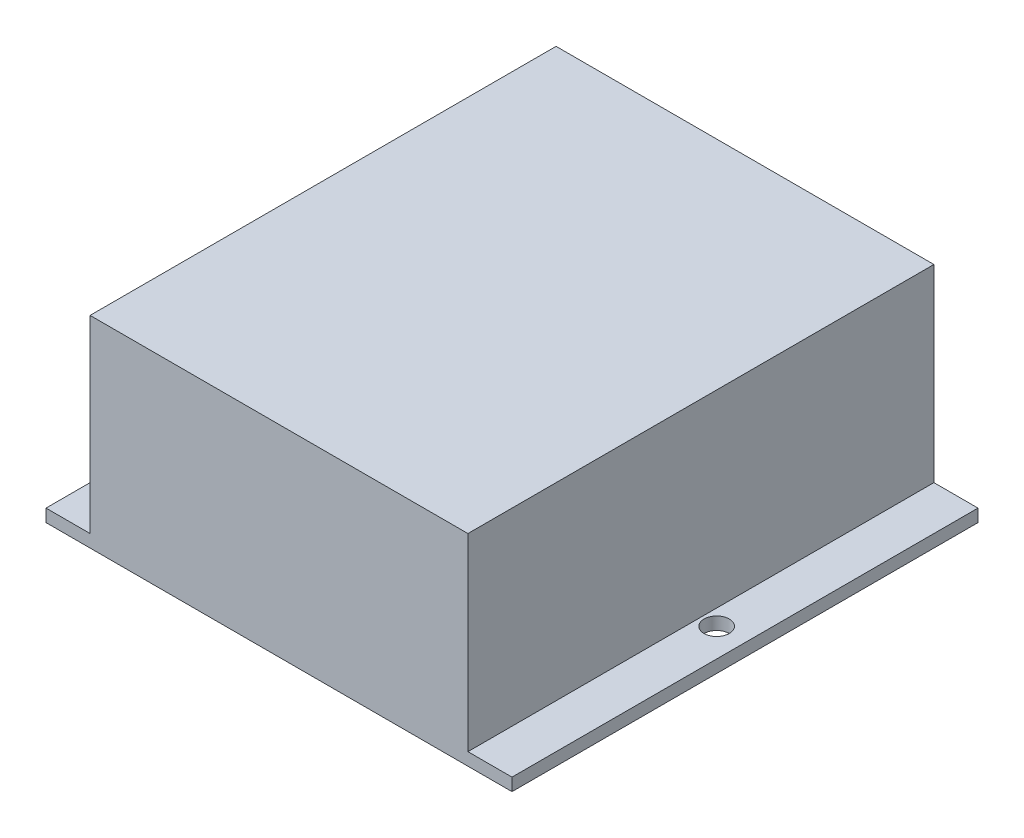
ISO-10303-21;
HEADER;
FILE_DESCRIPTION(('STEP AP214'),'2;1');
FILE_NAME('part.step','',(''),(''),'','','');
FILE_SCHEMA(('AUTOMOTIVE_DESIGN { 1 0 10303 214 1 1 1 1 }'));
ENDSEC;
DATA;
#1=APPLICATION_CONTEXT('core data for automotive mechanical design processes');
#2=APPLICATION_PROTOCOL_DEFINITION('international standard','automotive_design',2000,#1);
#3=PRODUCT_CONTEXT('',#1,'mechanical');
#4=PRODUCT('Part','Part','',(#3));
#5=PRODUCT_RELATED_PRODUCT_CATEGORY('part','',(#4));
#6=PRODUCT_DEFINITION_FORMATION('','',#4);
#7=PRODUCT_DEFINITION_CONTEXT('part definition',#1,'design');
#8=PRODUCT_DEFINITION('design','',#6,#7);
#9=PRODUCT_DEFINITION_SHAPE('','',#8);
#10=(LENGTH_UNIT() NAMED_UNIT(*) SI_UNIT(.MILLI.,.METRE.));
#11=(NAMED_UNIT(*) PLANE_ANGLE_UNIT() SI_UNIT($,.RADIAN.));
#12=(NAMED_UNIT(*) SI_UNIT($,.STERADIAN.) SOLID_ANGLE_UNIT());
#13=UNCERTAINTY_MEASURE_WITH_UNIT(LENGTH_MEASURE(1.E-05),#10,'distance_accuracy_value','');
#14=(GEOMETRIC_REPRESENTATION_CONTEXT(3) GLOBAL_UNCERTAINTY_ASSIGNED_CONTEXT((#13)) GLOBAL_UNIT_ASSIGNED_CONTEXT((#10,
#11,#12)) REPRESENTATION_CONTEXT('',''));
#15=CARTESIAN_POINT('',(0.,0.,0.));
#16=DIRECTION('',(0.,0.,1.));
#17=DIRECTION('',(1.,0.,0.));
#18=AXIS2_PLACEMENT_3D('',#15,#16,#17);
#19=CARTESIAN_POINT('',(0.,2.,0.));
#20=DIRECTION('',(0.,-1.,0.));
#21=DIRECTION('',(0.,0.,-1.));
#22=AXIS2_PLACEMENT_3D('',#19,#20,#21);
#23=PLANE('',#22);
#24=CARTESIAN_POINT('',(69.5,2.,-37.));
#25=DIRECTION('',(0.,-1.,0.));
#26=DIRECTION('',(0.,0.,1.));
#27=AXIS2_PLACEMENT_3D('',#24,#25,#26);
#28=CIRCLE('',#27,2.00000000000001);
#29=CARTESIAN_POINT('',(69.5,2.,-35.));
#30=VERTEX_POINT('',#29);
#31=EDGE_CURVE('E292',#30,#30,#28,.T.);
#32=ORIENTED_EDGE('',*,*,#31,.T.);
#33=EDGE_LOOP('',(#32));
#34=FACE_BOUND('',#33,.T.);
#35=DIRECTION('',(0.,0.,-1.));
#36=VECTOR('',#35,1.);
#37=CARTESIAN_POINT('',(67.,2.,0.));
#38=LINE('',#37,#36);
#39=CARTESIAN_POINT('',(67.,2.,0.));
#40=VERTEX_POINT('',#39);
#41=CARTESIAN_POINT('',(67.,2.,-74.));
#42=VERTEX_POINT('',#41);
#43=EDGE_CURVE('E119',#40,#42,#38,.T.);
#44=ORIENTED_EDGE('',*,*,#43,.F.);
#45=DIRECTION('',(1.,0.,0.));
#46=VECTOR('',#45,1.);
#47=CARTESIAN_POINT('',(0.,2.,0.));
#48=LINE('',#47,#46);
#49=CARTESIAN_POINT('',(74.,2.,0.));
#50=VERTEX_POINT('',#49);
#51=EDGE_CURVE('E132',#40,#50,#48,.T.);
#52=ORIENTED_EDGE('',*,*,#51,.T.);
#53=DIRECTION('',(0.,0.,-1.));
#54=VECTOR('',#53,1.);
#55=CARTESIAN_POINT('',(74.,2.,0.));
#56=LINE('',#55,#54);
#57=CARTESIAN_POINT('',(74.,2.,-74.));
#58=VERTEX_POINT('',#57);
#59=EDGE_CURVE('E136',#50,#58,#56,.T.);
#60=ORIENTED_EDGE('',*,*,#59,.T.);
#61=DIRECTION('',(-1.,0.,0.));
#62=VECTOR('',#61,1.);
#63=CARTESIAN_POINT('',(0.,2.,-74.));
#64=LINE('',#63,#62);
#65=EDGE_CURVE('E56',#58,#42,#64,.T.);
#66=ORIENTED_EDGE('',*,*,#65,.T.);
#67=EDGE_LOOP('',(#44,#52,#60,#66));
#68=FACE_BOUND('',#67,.T.);
#69=ADVANCED_FACE('F33',(#34,#68),#23,.F.);
#70=CARTESIAN_POINT('',(4.5,2.,-37.));
#71=DIRECTION('',(0.,-1.,0.));
#72=DIRECTION('',(0.,0.,-1.));
#73=AXIS2_PLACEMENT_3D('',#70,#71,#72);
#74=CIRCLE('',#73,2.);
#75=CARTESIAN_POINT('',(4.5,2.,-39.));
#76=VERTEX_POINT('',#75);
#77=EDGE_CURVE('E176',#76,#76,#74,.T.);
#78=ORIENTED_EDGE('',*,*,#77,.T.);
#79=EDGE_LOOP('',(#78));
#80=FACE_BOUND('',#79,.T.);
#81=DIRECTION('',(0.,0.,1.));
#82=VECTOR('',#81,1.);
#83=CARTESIAN_POINT('',(7.,2.,0.));
#84=LINE('',#83,#82);
#85=CARTESIAN_POINT('',(7.,2.,-74.));
#86=VERTEX_POINT('',#85);
#87=CARTESIAN_POINT('',(7.,2.,0.));
#88=VERTEX_POINT('',#87);
#89=EDGE_CURVE('E48',#86,#88,#84,.T.);
#90=ORIENTED_EDGE('',*,*,#89,.F.);
#91=CARTESIAN_POINT('',(0.,2.,-74.));
#92=VERTEX_POINT('',#91);
#93=EDGE_CURVE('E138',#86,#92,#64,.T.);
#94=ORIENTED_EDGE('',*,*,#93,.T.);
#95=DIRECTION('',(0.,0.,1.));
#96=VECTOR('',#95,1.);
#97=CARTESIAN_POINT('',(0.,2.,0.));
#98=LINE('',#97,#96);
#99=CARTESIAN_POINT('',(0.,2.,0.));
#100=VERTEX_POINT('',#99);
#101=EDGE_CURVE('E129',#92,#100,#98,.T.);
#102=ORIENTED_EDGE('',*,*,#101,.T.);
#103=EDGE_CURVE('E134',#100,#88,#48,.T.);
#104=ORIENTED_EDGE('',*,*,#103,.T.);
#105=EDGE_LOOP('',(#90,#94,#102,#104));
#106=FACE_BOUND('',#105,.T.);
#107=ADVANCED_FACE('F166',(#80,#106),#23,.F.);
#108=CARTESIAN_POINT('',(0.,2.,0.));
#109=DIRECTION('',(1.,0.,0.));
#110=DIRECTION('',(0.,0.,-1.));
#111=AXIS2_PLACEMENT_3D('',#108,#109,#110);
#112=PLANE('',#111);
#113=DIRECTION('',(0.,0.,1.));
#114=VECTOR('',#113,1.);
#115=CARTESIAN_POINT('',(0.,0.,0.));
#116=LINE('',#115,#114);
#117=CARTESIAN_POINT('',(0.,0.,-74.));
#118=VERTEX_POINT('',#117);
#119=CARTESIAN_POINT('',(0.,0.,0.));
#120=VERTEX_POINT('',#119);
#121=EDGE_CURVE('E120',#118,#120,#116,.T.);
#122=ORIENTED_EDGE('',*,*,#121,.T.);
#123=DIRECTION('',(0.,-1.,0.));
#124=VECTOR('',#123,1.);
#125=CARTESIAN_POINT('',(0.,2.,0.));
#126=LINE('',#125,#124);
#127=EDGE_CURVE('E11',#100,#120,#126,.T.);
#128=ORIENTED_EDGE('',*,*,#127,.F.);
#129=ORIENTED_EDGE('',*,*,#101,.F.);
#130=DIRECTION('',(0.,-1.,0.));
#131=VECTOR('',#130,1.);
#132=CARTESIAN_POINT('',(0.,2.,-74.));
#133=LINE('',#132,#131);
#134=EDGE_CURVE('E139',#92,#118,#133,.T.);
#135=ORIENTED_EDGE('',*,*,#134,.T.);
#136=EDGE_LOOP('',(#122,#128,#129,#135));
#137=FACE_BOUND('',#136,.T.);
#138=ADVANCED_FACE('F35',(#137),#112,.F.);
#139=CARTESIAN_POINT('',(0.,2.,0.));
#140=DIRECTION('',(0.,0.,-1.));
#141=DIRECTION('',(-1.,0.,0.));
#142=AXIS2_PLACEMENT_3D('',#139,#140,#141);
#143=PLANE('',#142);
#144=DIRECTION('',(1.,0.,0.));
#145=VECTOR('',#144,1.);
#146=CARTESIAN_POINT('',(0.,0.,0.));
#147=LINE('',#146,#145);
#148=CARTESIAN_POINT('',(74.,0.,0.));
#149=VERTEX_POINT('',#148);
#150=EDGE_CURVE('E123',#120,#149,#147,.T.);
#151=ORIENTED_EDGE('',*,*,#150,.T.);
#152=DIRECTION('',(0.,-1.,0.));
#153=VECTOR('',#152,1.);
#154=CARTESIAN_POINT('',(74.,2.,0.));
#155=LINE('',#154,#153);
#156=EDGE_CURVE('E41',#50,#149,#155,.T.);
#157=ORIENTED_EDGE('',*,*,#156,.F.);
#158=ORIENTED_EDGE('',*,*,#51,.F.);
#159=DIRECTION('',(0.,-1.,0.));
#160=VECTOR('',#159,1.);
#161=CARTESIAN_POINT('',(67.,32.,0.));
#162=LINE('',#161,#160);
#163=CARTESIAN_POINT('',(67.,32.,0.));
#164=VERTEX_POINT('',#163);
#165=EDGE_CURVE('E172',#164,#40,#162,.T.);
#166=ORIENTED_EDGE('',*,*,#165,.F.);
#167=DIRECTION('',(1.,0.,0.));
#168=VECTOR('',#167,1.);
#169=CARTESIAN_POINT('',(7.,32.,0.));
#170=LINE('',#169,#168);
#171=CARTESIAN_POINT('',(7.,32.,0.));
#172=VERTEX_POINT('',#171);
#173=EDGE_CURVE('E113',#172,#164,#170,.T.);
#174=ORIENTED_EDGE('',*,*,#173,.F.);
#175=DIRECTION('',(0.,-1.,0.));
#176=VECTOR('',#175,1.);
#177=CARTESIAN_POINT('',(7.,32.,0.));
#178=LINE('',#177,#176);
#179=EDGE_CURVE('E125',#172,#88,#178,.T.);
#180=ORIENTED_EDGE('',*,*,#179,.T.);
#181=ORIENTED_EDGE('',*,*,#103,.F.);
#182=ORIENTED_EDGE('',*,*,#127,.T.);
#183=EDGE_LOOP('',(#151,#157,#158,#166,#174,#180,#181,#182));
#184=FACE_BOUND('',#183,.T.);
#185=ADVANCED_FACE('F178',(#184),#143,.F.);
#186=CARTESIAN_POINT('',(74.,2.,0.));
#187=DIRECTION('',(-1.,0.,0.));
#188=DIRECTION('',(0.,0.,1.));
#189=AXIS2_PLACEMENT_3D('',#186,#187,#188);
#190=PLANE('',#189);
#191=DIRECTION('',(0.,0.,-1.));
#192=VECTOR('',#191,1.);
#193=CARTESIAN_POINT('',(74.,0.,0.));
#194=LINE('',#193,#192);
#195=CARTESIAN_POINT('',(74.,0.,-74.));
#196=VERTEX_POINT('',#195);
#197=EDGE_CURVE('E142',#149,#196,#194,.T.);
#198=ORIENTED_EDGE('',*,*,#197,.T.);
#199=DIRECTION('',(0.,-1.,0.));
#200=VECTOR('',#199,1.);
#201=CARTESIAN_POINT('',(74.,2.,-74.));
#202=LINE('',#201,#200);
#203=EDGE_CURVE('E147',#58,#196,#202,.T.);
#204=ORIENTED_EDGE('',*,*,#203,.F.);
#205=ORIENTED_EDGE('',*,*,#59,.F.);
#206=ORIENTED_EDGE('',*,*,#156,.T.);
#207=EDGE_LOOP('',(#198,#204,#205,#206));
#208=FACE_BOUND('',#207,.T.);
#209=ADVANCED_FACE('F154',(#208),#190,.F.);
#210=CARTESIAN_POINT('',(0.,2.,-74.));
#211=DIRECTION('',(0.,0.,1.));
#212=DIRECTION('',(1.,0.,0.));
#213=AXIS2_PLACEMENT_3D('',#210,#211,#212);
#214=PLANE('',#213);
#215=DIRECTION('',(-1.,0.,0.));
#216=VECTOR('',#215,1.);
#217=CARTESIAN_POINT('',(0.,0.,-74.));
#218=LINE('',#217,#216);
#219=EDGE_CURVE('E133',#196,#118,#218,.T.);
#220=ORIENTED_EDGE('',*,*,#219,.T.);
#221=ORIENTED_EDGE('',*,*,#134,.F.);
#222=ORIENTED_EDGE('',*,*,#93,.F.);
#223=DIRECTION('',(0.,-1.,0.));
#224=VECTOR('',#223,1.);
#225=CARTESIAN_POINT('',(7.,32.,-74.));
#226=LINE('',#225,#224);
#227=CARTESIAN_POINT('',(7.,32.,-74.));
#228=VERTEX_POINT('',#227);
#229=EDGE_CURVE('E104',#228,#86,#226,.T.);
#230=ORIENTED_EDGE('',*,*,#229,.F.);
#231=DIRECTION('',(-1.,0.,0.));
#232=VECTOR('',#231,1.);
#233=CARTESIAN_POINT('',(7.,32.,-74.));
#234=LINE('',#233,#232);
#235=CARTESIAN_POINT('',(67.,32.,-74.));
#236=VERTEX_POINT('',#235);
#237=EDGE_CURVE('E97',#236,#228,#234,.T.);
#238=ORIENTED_EDGE('',*,*,#237,.F.);
#239=DIRECTION('',(0.,-1.,0.));
#240=VECTOR('',#239,1.);
#241=CARTESIAN_POINT('',(67.,32.,-74.));
#242=LINE('',#241,#240);
#243=EDGE_CURVE('E101',#236,#42,#242,.T.);
#244=ORIENTED_EDGE('',*,*,#243,.T.);
#245=ORIENTED_EDGE('',*,*,#65,.F.);
#246=ORIENTED_EDGE('',*,*,#203,.T.);
#247=EDGE_LOOP('',(#220,#221,#222,#230,#238,#244,#245,#246));
#248=FACE_BOUND('',#247,.T.);
#249=ADVANCED_FACE('F99',(#248),#214,.F.);
#250=CARTESIAN_POINT('',(0.,0.,0.));
#251=DIRECTION('',(0.,-1.,0.));
#252=DIRECTION('',(0.,0.,-1.));
#253=AXIS2_PLACEMENT_3D('',#250,#251,#252);
#254=PLANE('',#253);
#255=CARTESIAN_POINT('',(4.5,0.,-37.));
#256=DIRECTION('',(0.,-1.,0.));
#257=DIRECTION('',(0.,0.,-1.));
#258=AXIS2_PLACEMENT_3D('',#255,#256,#257);
#259=CIRCLE('',#258,2.);
#260=CARTESIAN_POINT('',(4.5,0.,-39.));
#261=VERTEX_POINT('',#260);
#262=EDGE_CURVE('E291',#261,#261,#259,.T.);
#263=ORIENTED_EDGE('',*,*,#262,.F.);
#264=EDGE_LOOP('',(#263));
#265=FACE_BOUND('',#264,.T.);
#266=CARTESIAN_POINT('',(69.5,0.,-37.));
#267=DIRECTION('',(0.,-1.,0.));
#268=DIRECTION('',(0.,0.,1.));
#269=AXIS2_PLACEMENT_3D('',#266,#267,#268);
#270=CIRCLE('',#269,2.00000000000001);
#271=CARTESIAN_POINT('',(69.5,0.,-35.));
#272=VERTEX_POINT('',#271);
#273=EDGE_CURVE('E295',#272,#272,#270,.T.);
#274=ORIENTED_EDGE('',*,*,#273,.F.);
#275=EDGE_LOOP('',(#274));
#276=FACE_BOUND('',#275,.T.);
#277=ORIENTED_EDGE('',*,*,#121,.F.);
#278=ORIENTED_EDGE('',*,*,#219,.F.);
#279=ORIENTED_EDGE('',*,*,#197,.F.);
#280=ORIENTED_EDGE('',*,*,#150,.F.);
#281=EDGE_LOOP('',(#277,#278,#279,#280));
#282=FACE_BOUND('',#281,.T.);
#283=ADVANCED_FACE('F161',(#265,#276,#282),#254,.T.);
#284=CARTESIAN_POINT('',(67.,32.,0.));
#285=DIRECTION('',(-1.,0.,0.));
#286=DIRECTION('',(0.,0.,1.));
#287=AXIS2_PLACEMENT_3D('',#284,#285,#286);
#288=PLANE('',#287);
#289=ORIENTED_EDGE('',*,*,#43,.T.);
#290=ORIENTED_EDGE('',*,*,#243,.F.);
#291=DIRECTION('',(0.,0.,-1.));
#292=VECTOR('',#291,1.);
#293=CARTESIAN_POINT('',(67.,32.,0.));
#294=LINE('',#293,#292);
#295=EDGE_CURVE('E108',#164,#236,#294,.T.);
#296=ORIENTED_EDGE('',*,*,#295,.F.);
#297=ORIENTED_EDGE('',*,*,#165,.T.);
#298=EDGE_LOOP('',(#289,#290,#296,#297));
#299=FACE_BOUND('',#298,.T.);
#300=ADVANCED_FACE('F118',(#299),#288,.F.);
#301=CARTESIAN_POINT('',(7.,32.,0.));
#302=DIRECTION('',(1.,0.,0.));
#303=DIRECTION('',(0.,0.,-1.));
#304=AXIS2_PLACEMENT_3D('',#301,#302,#303);
#305=PLANE('',#304);
#306=ORIENTED_EDGE('',*,*,#89,.T.);
#307=ORIENTED_EDGE('',*,*,#179,.F.);
#308=DIRECTION('',(0.,0.,1.));
#309=VECTOR('',#308,1.);
#310=CARTESIAN_POINT('',(7.,32.,0.));
#311=LINE('',#310,#309);
#312=EDGE_CURVE('E107',#228,#172,#311,.T.);
#313=ORIENTED_EDGE('',*,*,#312,.F.);
#314=ORIENTED_EDGE('',*,*,#229,.T.);
#315=EDGE_LOOP('',(#306,#307,#313,#314));
#316=FACE_BOUND('',#315,.T.);
#317=ADVANCED_FACE('F168',(#316),#305,.F.);
#318=CARTESIAN_POINT('',(0.,32.,0.));
#319=DIRECTION('',(0.,-1.,0.));
#320=DIRECTION('',(0.,0.,-1.));
#321=AXIS2_PLACEMENT_3D('',#318,#319,#320);
#322=PLANE('',#321);
#323=ORIENTED_EDGE('',*,*,#295,.T.);
#324=ORIENTED_EDGE('',*,*,#237,.T.);
#325=ORIENTED_EDGE('',*,*,#312,.T.);
#326=ORIENTED_EDGE('',*,*,#173,.T.);
#327=EDGE_LOOP('',(#323,#324,#325,#326));
#328=FACE_BOUND('',#327,.T.);
#329=ADVANCED_FACE('F111',(#328),#322,.F.);
#330=CARTESIAN_POINT('',(69.5,2.,-37.));
#331=DIRECTION('',(0.,-1.,0.));
#332=DIRECTION('',(0.,0.,-1.));
#333=AXIS2_PLACEMENT_3D('',#330,#331,#332);
#334=CYLINDRICAL_SURFACE('',#333,2.00000000000001);
#335=ORIENTED_EDGE('',*,*,#31,.F.);
#336=EDGE_LOOP('',(#335));
#337=FACE_BOUND('',#336,.T.);
#338=ORIENTED_EDGE('',*,*,#273,.T.);
#339=EDGE_LOOP('',(#338));
#340=FACE_BOUND('',#339,.T.);
#341=ADVANCED_FACE('F223',(#337,#340),#334,.F.);
#342=CARTESIAN_POINT('',(4.5,2.,-37.));
#343=DIRECTION('',(0.,-1.,0.));
#344=DIRECTION('',(0.,0.,-1.));
#345=AXIS2_PLACEMENT_3D('',#342,#343,#344);
#346=CYLINDRICAL_SURFACE('',#345,2.);
#347=ORIENTED_EDGE('',*,*,#77,.F.);
#348=EDGE_LOOP('',(#347));
#349=FACE_BOUND('',#348,.T.);
#350=ORIENTED_EDGE('',*,*,#262,.T.);
#351=EDGE_LOOP('',(#350));
#352=FACE_BOUND('',#351,.T.);
#353=ADVANCED_FACE('F228',(#349,#352),#346,.F.);
#354=CLOSED_SHELL('',(#69,#107,#138,#185,#209,#249,#283,#300,#317,#329,#341,#353));
#355=MANIFOLD_SOLID_BREP('B2',#354);
#356=ADVANCED_BREP_SHAPE_REPRESENTATION('',(#18,#355),#14);
#357=SHAPE_DEFINITION_REPRESENTATION(#9,#356);
ENDSEC;
END-ISO-10303-21;
